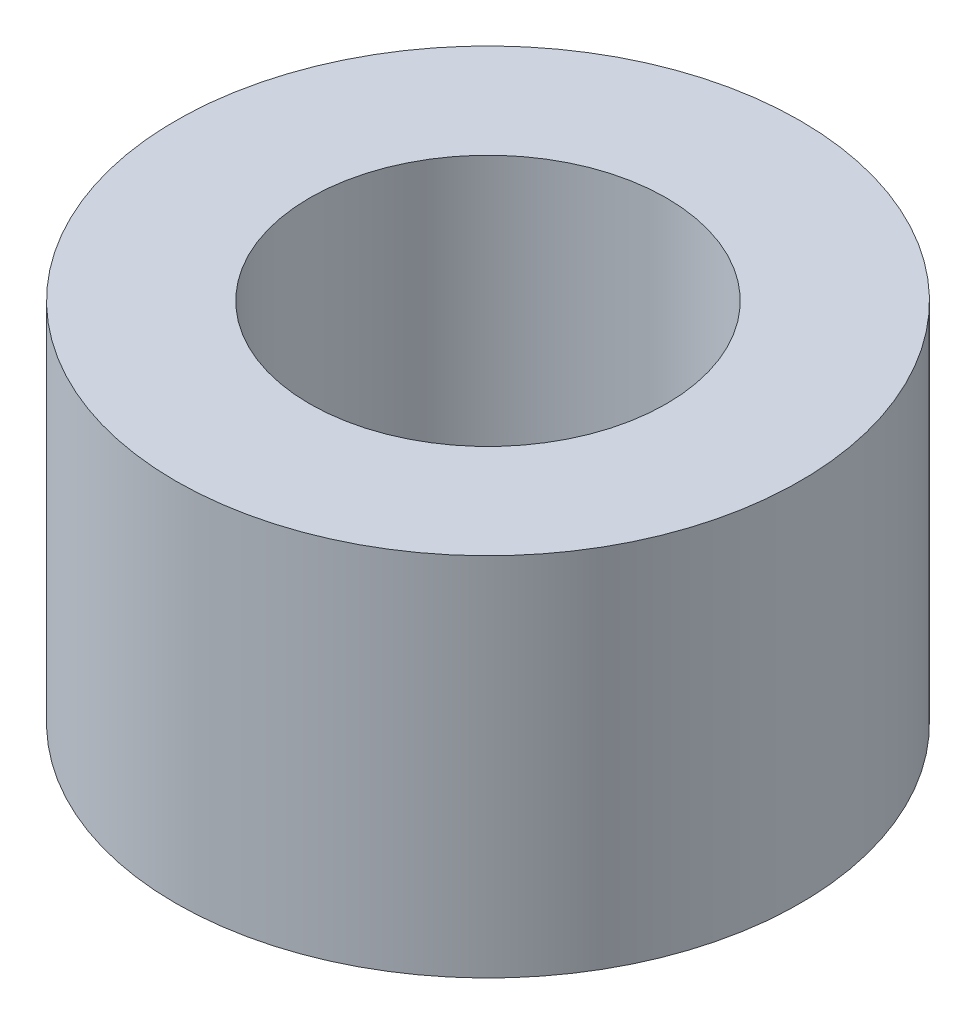
ISO-10303-21;
HEADER;
FILE_DESCRIPTION(('STEP AP214'),'2;1');
FILE_NAME('part.step','',(''),(''),'','','');
FILE_SCHEMA(('AUTOMOTIVE_DESIGN { 1 0 10303 214 1 1 1 1 }'));
ENDSEC;
DATA;
#1=APPLICATION_CONTEXT('core data for automotive mechanical design processes');
#2=APPLICATION_PROTOCOL_DEFINITION('international standard','automotive_design',2000,#1);
#3=PRODUCT_CONTEXT('',#1,'mechanical');
#4=PRODUCT('Part','Part','',(#3));
#5=PRODUCT_RELATED_PRODUCT_CATEGORY('part','',(#4));
#6=PRODUCT_DEFINITION_FORMATION('','',#4);
#7=PRODUCT_DEFINITION_CONTEXT('part definition',#1,'design');
#8=PRODUCT_DEFINITION('design','',#6,#7);
#9=PRODUCT_DEFINITION_SHAPE('','',#8);
#10=(LENGTH_UNIT() NAMED_UNIT(*) SI_UNIT(.MILLI.,.METRE.));
#11=(NAMED_UNIT(*) PLANE_ANGLE_UNIT() SI_UNIT($,.RADIAN.));
#12=(NAMED_UNIT(*) SI_UNIT($,.STERADIAN.) SOLID_ANGLE_UNIT());
#13=UNCERTAINTY_MEASURE_WITH_UNIT(LENGTH_MEASURE(1.E-05),#10,'distance_accuracy_value','');
#14=(GEOMETRIC_REPRESENTATION_CONTEXT(3) GLOBAL_UNCERTAINTY_ASSIGNED_CONTEXT((#13)) GLOBAL_UNIT_ASSIGNED_CONTEXT((#10,
#11,#12)) REPRESENTATION_CONTEXT('',''));
#15=CARTESIAN_POINT('',(0.,0.,0.));
#16=DIRECTION('',(0.,0.,1.));
#17=DIRECTION('',(1.,0.,0.));
#18=AXIS2_PLACEMENT_3D('',#15,#16,#17);
#19=CARTESIAN_POINT('',(0.,4.1,0.));
#20=DIRECTION('',(0.,1.,0.));
#21=DIRECTION('',(0.,0.,1.));
#22=AXIS2_PLACEMENT_3D('',#19,#20,#21);
#23=PLANE('',#22);
#24=CARTESIAN_POINT('',(0.,4.1,0.));
#25=DIRECTION('',(0.,1.,0.));
#26=DIRECTION('',(0.,0.,1.));
#27=AXIS2_PLACEMENT_3D('',#24,#25,#26);
#28=CIRCLE('',#27,3.5);
#29=CARTESIAN_POINT('',(0.,4.1,3.5));
#30=VERTEX_POINT('',#29);
#31=EDGE_CURVE('E10',#30,#30,#28,.T.);
#32=ORIENTED_EDGE('',*,*,#31,.T.);
#33=EDGE_LOOP('',(#32));
#34=FACE_BOUND('',#33,.T.);
#35=CARTESIAN_POINT('',(0.,4.1,0.));
#36=DIRECTION('',(0.,1.,0.));
#37=DIRECTION('',(0.,0.,1.));
#38=AXIS2_PLACEMENT_3D('',#35,#36,#37);
#39=CIRCLE('',#38,2.);
#40=CARTESIAN_POINT('',(0.,4.1,2.));
#41=VERTEX_POINT('',#40);
#42=EDGE_CURVE('E53',#41,#41,#39,.T.);
#43=ORIENTED_EDGE('',*,*,#42,.F.);
#44=EDGE_LOOP('',(#43));
#45=FACE_BOUND('',#44,.T.);
#46=ADVANCED_FACE('F40',(#34,#45),#23,.T.);
#47=CARTESIAN_POINT('',(0.,0.,0.));
#48=DIRECTION('',(0.,1.,0.));
#49=DIRECTION('',(0.,0.,1.));
#50=AXIS2_PLACEMENT_3D('',#47,#48,#49);
#51=PLANE('',#50);
#52=CARTESIAN_POINT('',(0.,0.,0.));
#53=DIRECTION('',(0.,1.,0.));
#54=DIRECTION('',(0.,0.,1.));
#55=AXIS2_PLACEMENT_3D('',#52,#53,#54);
#56=CIRCLE('',#55,3.5);
#57=CARTESIAN_POINT('',(0.,0.,3.5));
#58=VERTEX_POINT('',#57);
#59=EDGE_CURVE('E44',#58,#58,#56,.T.);
#60=ORIENTED_EDGE('',*,*,#59,.F.);
#61=EDGE_LOOP('',(#60));
#62=FACE_BOUND('',#61,.T.);
#63=CARTESIAN_POINT('',(0.,0.,0.));
#64=DIRECTION('',(0.,1.,0.));
#65=DIRECTION('',(0.,0.,1.));
#66=AXIS2_PLACEMENT_3D('',#63,#64,#65);
#67=CIRCLE('',#66,2.);
#68=CARTESIAN_POINT('',(0.,0.,2.));
#69=VERTEX_POINT('',#68);
#70=EDGE_CURVE('E55',#69,#69,#67,.T.);
#71=ORIENTED_EDGE('',*,*,#70,.T.);
#72=EDGE_LOOP('',(#71));
#73=FACE_BOUND('',#72,.T.);
#74=ADVANCED_FACE('F67',(#62,#73),#51,.F.);
#75=CARTESIAN_POINT('',(0.,4.1,0.));
#76=DIRECTION('',(0.,-1.,0.));
#77=DIRECTION('',(0.,0.,-1.));
#78=AXIS2_PLACEMENT_3D('',#75,#76,#77);
#79=CYLINDRICAL_SURFACE('',#78,3.5);
#80=ORIENTED_EDGE('',*,*,#31,.F.);
#81=EDGE_LOOP('',(#80));
#82=FACE_BOUND('',#81,.T.);
#83=ORIENTED_EDGE('',*,*,#59,.T.);
#84=EDGE_LOOP('',(#83));
#85=FACE_BOUND('',#84,.T.);
#86=ADVANCED_FACE('F42',(#82,#85),#79,.T.);
#87=CARTESIAN_POINT('',(0.,4.1,0.));
#88=DIRECTION('',(0.,-1.,0.));
#89=DIRECTION('',(0.,0.,-1.));
#90=AXIS2_PLACEMENT_3D('',#87,#88,#89);
#91=CYLINDRICAL_SURFACE('',#90,2.);
#92=ORIENTED_EDGE('',*,*,#42,.T.);
#93=EDGE_LOOP('',(#92));
#94=FACE_BOUND('',#93,.T.);
#95=ORIENTED_EDGE('',*,*,#70,.F.);
#96=EDGE_LOOP('',(#95));
#97=FACE_BOUND('',#96,.T.);
#98=ADVANCED_FACE('F63',(#94,#97),#91,.F.);
#99=CLOSED_SHELL('',(#46,#74,#86,#98));
#100=MANIFOLD_SOLID_BREP('B2',#99);
#101=ADVANCED_BREP_SHAPE_REPRESENTATION('',(#18,#100),#14);
#102=SHAPE_DEFINITION_REPRESENTATION(#9,#101);
ENDSEC;
END-ISO-10303-21;
